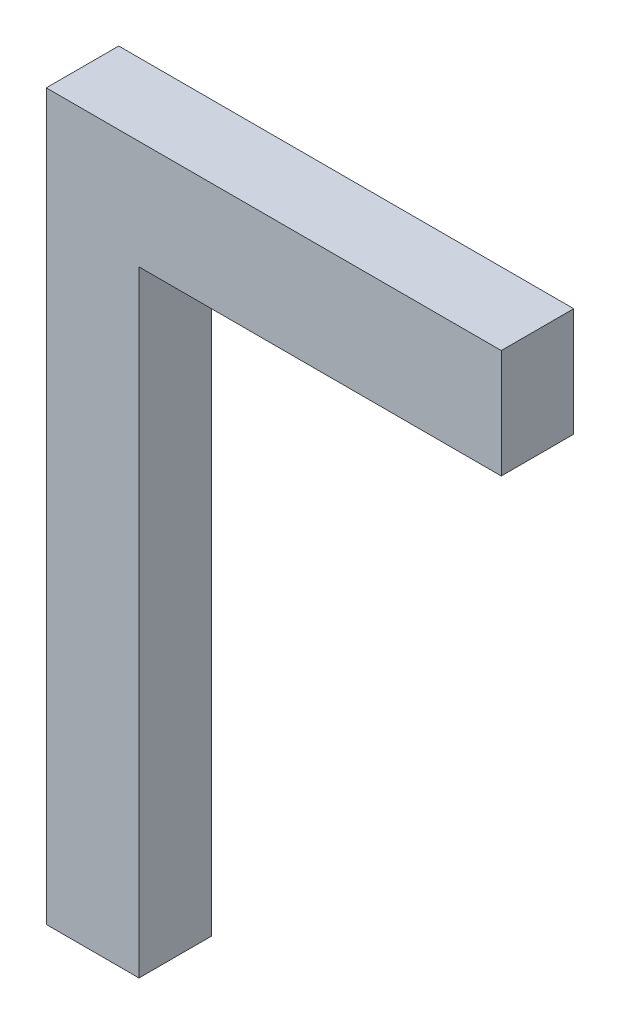
ISO-10303-21;
HEADER;
FILE_DESCRIPTION(('STEP AP214'),'2;1');
FILE_NAME('part.step','',(''),(''),'','','');
FILE_SCHEMA(('AUTOMOTIVE_DESIGN { 1 0 10303 214 1 1 1 1 }'));
ENDSEC;
DATA;
#1=APPLICATION_CONTEXT('core data for automotive mechanical design processes');
#2=APPLICATION_PROTOCOL_DEFINITION('international standard','automotive_design',2000,#1);
#3=PRODUCT_CONTEXT('',#1,'mechanical');
#4=PRODUCT('Part','Part','',(#3));
#5=PRODUCT_RELATED_PRODUCT_CATEGORY('part','',(#4));
#6=PRODUCT_DEFINITION_FORMATION('','',#4);
#7=PRODUCT_DEFINITION_CONTEXT('part definition',#1,'design');
#8=PRODUCT_DEFINITION('design','',#6,#7);
#9=PRODUCT_DEFINITION_SHAPE('','',#8);
#10=(LENGTH_UNIT() NAMED_UNIT(*) SI_UNIT(.MILLI.,.METRE.));
#11=(NAMED_UNIT(*) PLANE_ANGLE_UNIT() SI_UNIT($,.RADIAN.));
#12=(NAMED_UNIT(*) SI_UNIT($,.STERADIAN.) SOLID_ANGLE_UNIT());
#13=UNCERTAINTY_MEASURE_WITH_UNIT(LENGTH_MEASURE(1.E-05),#10,'distance_accuracy_value','');
#14=(GEOMETRIC_REPRESENTATION_CONTEXT(3) GLOBAL_UNCERTAINTY_ASSIGNED_CONTEXT((#13)) GLOBAL_UNIT_ASSIGNED_CONTEXT((#10,
#11,#12)) REPRESENTATION_CONTEXT('',''));
#15=CARTESIAN_POINT('',(0.,0.,0.));
#16=DIRECTION('',(0.,0.,1.));
#17=DIRECTION('',(1.,0.,0.));
#18=AXIS2_PLACEMENT_3D('',#15,#16,#17);
#19=CARTESIAN_POINT('',(64.,1000.,50.));
#20=DIRECTION('',(-1.,0.,0.));
#21=DIRECTION('',(0.,0.,1.));
#22=AXIS2_PLACEMENT_3D('',#19,#20,#21);
#23=PLANE('',#22);
#24=DIRECTION('',(0.,0.,-1.));
#25=VECTOR('',#24,1.);
#26=CARTESIAN_POINT('',(64.,850.,-50.));
#27=LINE('',#26,#25);
#28=CARTESIAN_POINT('',(64.,850.,50.));
#29=VERTEX_POINT('',#28);
#30=CARTESIAN_POINT('',(64.,850.,-50.));
#31=VERTEX_POINT('',#30);
#32=EDGE_CURVE('E48',#29,#31,#27,.T.);
#33=ORIENTED_EDGE('',*,*,#32,.F.);
#34=DIRECTION('',(0.,-1.,0.));
#35=VECTOR('',#34,1.);
#36=CARTESIAN_POINT('',(64.,1000.,50.));
#37=LINE('',#36,#35);
#38=CARTESIAN_POINT('',(64.,0.,50.));
#39=VERTEX_POINT('',#38);
#40=EDGE_CURVE('E41',#29,#39,#37,.T.);
#41=ORIENTED_EDGE('',*,*,#40,.T.);
#42=DIRECTION('',(0.,0.,-1.));
#43=VECTOR('',#42,1.);
#44=CARTESIAN_POINT('',(64.,0.,50.));
#45=LINE('',#44,#43);
#46=CARTESIAN_POINT('',(64.,0.,-50.));
#47=VERTEX_POINT('',#46);
#48=EDGE_CURVE('E87',#39,#47,#45,.T.);
#49=ORIENTED_EDGE('',*,*,#48,.T.);
#50=DIRECTION('',(0.,-1.,0.));
#51=VECTOR('',#50,1.);
#52=CARTESIAN_POINT('',(64.,1000.,-50.));
#53=LINE('',#52,#51);
#54=EDGE_CURVE('E81',#31,#47,#53,.T.);
#55=ORIENTED_EDGE('',*,*,#54,.F.);
#56=EDGE_LOOP('',(#33,#41,#49,#55));
#57=FACE_BOUND('',#56,.T.);
#58=ADVANCED_FACE('F33',(#57),#23,.F.);
#59=CARTESIAN_POINT('',(-64.,1000.,50.));
#60=DIRECTION('',(1.,0.,0.));
#61=DIRECTION('',(0.,0.,-1.));
#62=AXIS2_PLACEMENT_3D('',#59,#60,#61);
#63=PLANE('',#62);
#64=DIRECTION('',(0.,0.,1.));
#65=VECTOR('',#64,1.);
#66=CARTESIAN_POINT('',(-64.,0.,50.));
#67=LINE('',#66,#65);
#68=CARTESIAN_POINT('',(-64.,0.,-50.));
#69=VERTEX_POINT('',#68);
#70=CARTESIAN_POINT('',(-64.,0.,50.));
#71=VERTEX_POINT('',#70);
#72=EDGE_CURVE('E92',#69,#71,#67,.T.);
#73=ORIENTED_EDGE('',*,*,#72,.T.);
#74=DIRECTION('',(0.,-1.,0.));
#75=VECTOR('',#74,1.);
#76=CARTESIAN_POINT('',(-64.,1000.,50.));
#77=LINE('',#76,#75);
#78=CARTESIAN_POINT('',(-64.,1000.,50.));
#79=VERTEX_POINT('',#78);
#80=EDGE_CURVE('E11',#79,#71,#77,.T.);
#81=ORIENTED_EDGE('',*,*,#80,.F.);
#82=DIRECTION('',(0.,0.,1.));
#83=VECTOR('',#82,1.);
#84=CARTESIAN_POINT('',(-64.,1000.,50.));
#85=LINE('',#84,#83);
#86=CARTESIAN_POINT('',(-64.,1000.,-50.));
#87=VERTEX_POINT('',#86);
#88=EDGE_CURVE('E86',#87,#79,#85,.T.);
#89=ORIENTED_EDGE('',*,*,#88,.F.);
#90=DIRECTION('',(0.,-1.,0.));
#91=VECTOR('',#90,1.);
#92=CARTESIAN_POINT('',(-64.,1000.,-50.));
#93=LINE('',#92,#91);
#94=EDGE_CURVE('E78',#87,#69,#93,.T.);
#95=ORIENTED_EDGE('',*,*,#94,.T.);
#96=EDGE_LOOP('',(#73,#81,#89,#95));
#97=FACE_BOUND('',#96,.T.);
#98=ADVANCED_FACE('F35',(#97),#63,.F.);
#99=CARTESIAN_POINT('',(64.,1000.,50.));
#100=DIRECTION('',(0.,0.,-1.));
#101=DIRECTION('',(-1.,0.,0.));
#102=AXIS2_PLACEMENT_3D('',#99,#100,#101);
#103=PLANE('',#102);
#104=DIRECTION('',(1.,0.,0.));
#105=VECTOR('',#104,1.);
#106=CARTESIAN_POINT('',(64.,0.,50.));
#107=LINE('',#106,#105);
#108=EDGE_CURVE('E96',#71,#39,#107,.T.);
#109=ORIENTED_EDGE('',*,*,#108,.T.);
#110=ORIENTED_EDGE('',*,*,#40,.F.);
#111=DIRECTION('',(-1.,0.,0.));
#112=VECTOR('',#111,1.);
#113=CARTESIAN_POINT('',(564.,850.,50.));
#114=LINE('',#113,#112);
#115=CARTESIAN_POINT('',(564.,850.,50.));
#116=VERTEX_POINT('',#115);
#117=EDGE_CURVE('E97',#116,#29,#114,.T.);
#118=ORIENTED_EDGE('',*,*,#117,.F.);
#119=DIRECTION('',(0.,-1.,0.));
#120=VECTOR('',#119,1.);
#121=CARTESIAN_POINT('',(564.,1000.,50.));
#122=LINE('',#121,#120);
#123=CARTESIAN_POINT('',(564.,1000.,50.));
#124=VERTEX_POINT('',#123);
#125=EDGE_CURVE('E115',#124,#116,#122,.T.);
#126=ORIENTED_EDGE('',*,*,#125,.F.);
#127=DIRECTION('',(1.,0.,0.));
#128=VECTOR('',#127,1.);
#129=CARTESIAN_POINT('',(64.,1000.,50.));
#130=LINE('',#129,#128);
#131=EDGE_CURVE('E112',#79,#124,#130,.T.);
#132=ORIENTED_EDGE('',*,*,#131,.F.);
#133=ORIENTED_EDGE('',*,*,#80,.T.);
#134=EDGE_LOOP('',(#109,#110,#118,#126,#132,#133));
#135=FACE_BOUND('',#134,.T.);
#136=ADVANCED_FACE('F109',(#135),#103,.F.);
#137=CARTESIAN_POINT('',(64.,1000.,-50.));
#138=DIRECTION('',(0.,0.,1.));
#139=DIRECTION('',(1.,0.,0.));
#140=AXIS2_PLACEMENT_3D('',#137,#138,#139);
#141=PLANE('',#140);
#142=DIRECTION('',(-1.,0.,0.));
#143=VECTOR('',#142,1.);
#144=CARTESIAN_POINT('',(64.,0.,-50.));
#145=LINE('',#144,#143);
#146=EDGE_CURVE('E75',#47,#69,#145,.T.);
#147=ORIENTED_EDGE('',*,*,#146,.T.);
#148=ORIENTED_EDGE('',*,*,#94,.F.);
#149=DIRECTION('',(-1.,0.,0.));
#150=VECTOR('',#149,1.);
#151=CARTESIAN_POINT('',(64.,1000.,-50.));
#152=LINE('',#151,#150);
#153=CARTESIAN_POINT('',(564.,1000.,-50.));
#154=VERTEX_POINT('',#153);
#155=EDGE_CURVE('E57',#154,#87,#152,.T.);
#156=ORIENTED_EDGE('',*,*,#155,.F.);
#157=DIRECTION('',(0.,1.,0.));
#158=VECTOR('',#157,1.);
#159=CARTESIAN_POINT('',(564.,1000.,-50.));
#160=LINE('',#159,#158);
#161=CARTESIAN_POINT('',(564.,850.,-50.));
#162=VERTEX_POINT('',#161);
#163=EDGE_CURVE('E123',#162,#154,#160,.T.);
#164=ORIENTED_EDGE('',*,*,#163,.F.);
#165=DIRECTION('',(-1.,0.,0.));
#166=VECTOR('',#165,1.);
#167=CARTESIAN_POINT('',(564.,850.,-50.));
#168=LINE('',#167,#166);
#169=EDGE_CURVE('E101',#162,#31,#168,.T.);
#170=ORIENTED_EDGE('',*,*,#169,.T.);
#171=ORIENTED_EDGE('',*,*,#54,.T.);
#172=EDGE_LOOP('',(#147,#148,#156,#164,#170,#171));
#173=FACE_BOUND('',#172,.T.);
#174=ADVANCED_FACE('F77',(#173),#141,.F.);
#175=CARTESIAN_POINT('',(0.,1000.,0.));
#176=DIRECTION('',(0.,1.,0.));
#177=DIRECTION('',(0.,0.,1.));
#178=AXIS2_PLACEMENT_3D('',#175,#176,#177);
#179=PLANE('',#178);
#180=ORIENTED_EDGE('',*,*,#88,.T.);
#181=ORIENTED_EDGE('',*,*,#131,.T.);
#182=DIRECTION('',(0.,0.,1.));
#183=VECTOR('',#182,1.);
#184=CARTESIAN_POINT('',(564.,1000.,-50.));
#185=LINE('',#184,#183);
#186=EDGE_CURVE('E127',#154,#124,#185,.T.);
#187=ORIENTED_EDGE('',*,*,#186,.F.);
#188=ORIENTED_EDGE('',*,*,#155,.T.);
#189=EDGE_LOOP('',(#180,#181,#187,#188));
#190=FACE_BOUND('',#189,.T.);
#191=ADVANCED_FACE('F117',(#190),#179,.T.);
#192=CARTESIAN_POINT('',(0.,0.,0.));
#193=DIRECTION('',(0.,1.,0.));
#194=DIRECTION('',(0.,0.,1.));
#195=AXIS2_PLACEMENT_3D('',#192,#193,#194);
#196=PLANE('',#195);
#197=ORIENTED_EDGE('',*,*,#72,.F.);
#198=ORIENTED_EDGE('',*,*,#146,.F.);
#199=ORIENTED_EDGE('',*,*,#48,.F.);
#200=ORIENTED_EDGE('',*,*,#108,.F.);
#201=EDGE_LOOP('',(#197,#198,#199,#200));
#202=FACE_BOUND('',#201,.T.);
#203=ADVANCED_FACE('F94',(#202),#196,.F.);
#204=CARTESIAN_POINT('',(564.,850.,-50.));
#205=DIRECTION('',(0.,1.,0.));
#206=DIRECTION('',(0.,0.,1.));
#207=AXIS2_PLACEMENT_3D('',#204,#205,#206);
#208=PLANE('',#207);
#209=ORIENTED_EDGE('',*,*,#32,.T.);
#210=ORIENTED_EDGE('',*,*,#169,.F.);
#211=DIRECTION('',(0.,0.,-1.));
#212=VECTOR('',#211,1.);
#213=CARTESIAN_POINT('',(564.,850.,-50.));
#214=LINE('',#213,#212);
#215=EDGE_CURVE('E121',#116,#162,#214,.T.);
#216=ORIENTED_EDGE('',*,*,#215,.F.);
#217=ORIENTED_EDGE('',*,*,#117,.T.);
#218=EDGE_LOOP('',(#209,#210,#216,#217));
#219=FACE_BOUND('',#218,.T.);
#220=ADVANCED_FACE('F143',(#219),#208,.F.);
#221=CARTESIAN_POINT('',(564.,0.,0.));
#222=DIRECTION('',(-1.,0.,0.));
#223=DIRECTION('',(0.,0.,1.));
#224=AXIS2_PLACEMENT_3D('',#221,#222,#223);
#225=PLANE('',#224);
#226=ORIENTED_EDGE('',*,*,#163,.T.);
#227=ORIENTED_EDGE('',*,*,#186,.T.);
#228=ORIENTED_EDGE('',*,*,#125,.T.);
#229=ORIENTED_EDGE('',*,*,#215,.T.);
#230=EDGE_LOOP('',(#226,#227,#228,#229));
#231=FACE_BOUND('',#230,.T.);
#232=ADVANCED_FACE('F133',(#231),#225,.F.);
#233=CLOSED_SHELL('',(#58,#98,#136,#174,#191,#203,#220,#232));
#234=MANIFOLD_SOLID_BREP('B2',#233);
#235=ADVANCED_BREP_SHAPE_REPRESENTATION('',(#18,#234),#14);
#236=SHAPE_DEFINITION_REPRESENTATION(#9,#235);
ENDSEC;
END-ISO-10303-21;
